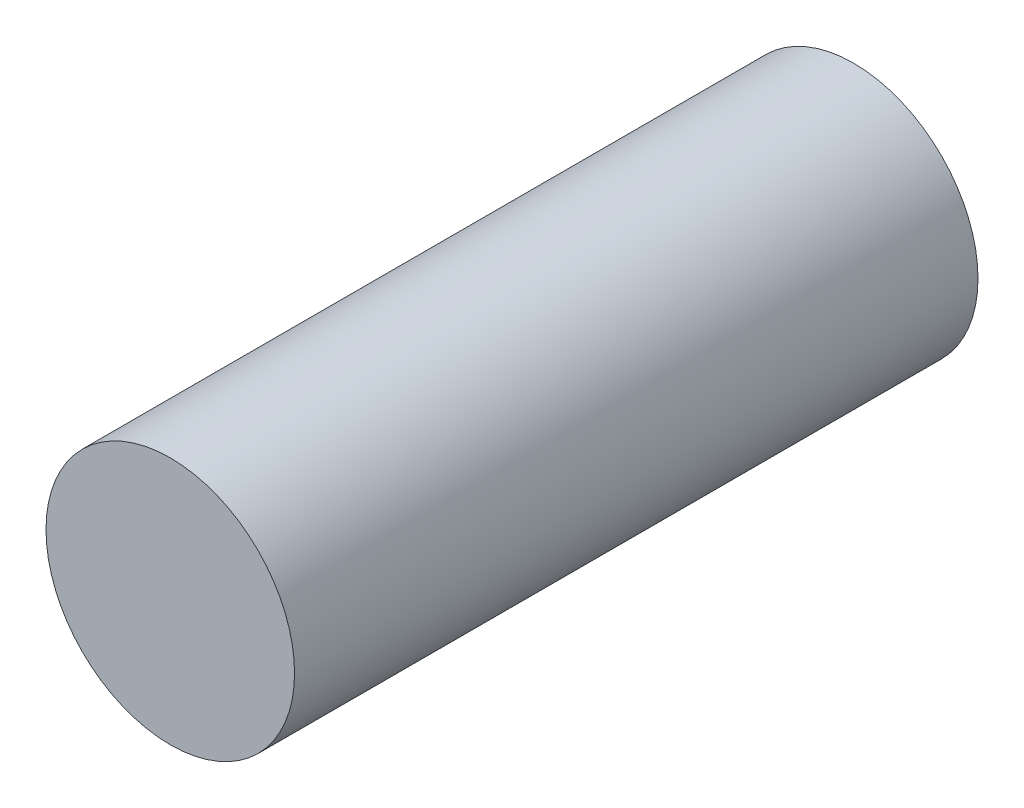
ISO-10303-21;
HEADER;
FILE_DESCRIPTION(('STEP AP214'),'2;1');
FILE_NAME('part.step','',(''),(''),'','','');
FILE_SCHEMA(('AUTOMOTIVE_DESIGN { 1 0 10303 214 1 1 1 1 }'));
ENDSEC;
DATA;
#1=APPLICATION_CONTEXT('core data for automotive mechanical design processes');
#2=APPLICATION_PROTOCOL_DEFINITION('international standard','automotive_design',2000,#1);
#3=PRODUCT_CONTEXT('',#1,'mechanical');
#4=PRODUCT('Part','Part','',(#3));
#5=PRODUCT_RELATED_PRODUCT_CATEGORY('part','',(#4));
#6=PRODUCT_DEFINITION_FORMATION('','',#4);
#7=PRODUCT_DEFINITION_CONTEXT('part definition',#1,'design');
#8=PRODUCT_DEFINITION('design','',#6,#7);
#9=PRODUCT_DEFINITION_SHAPE('','',#8);
#10=(LENGTH_UNIT() NAMED_UNIT(*) SI_UNIT(.MILLI.,.METRE.));
#11=(NAMED_UNIT(*) PLANE_ANGLE_UNIT() SI_UNIT($,.RADIAN.));
#12=(NAMED_UNIT(*) SI_UNIT($,.STERADIAN.) SOLID_ANGLE_UNIT());
#13=UNCERTAINTY_MEASURE_WITH_UNIT(LENGTH_MEASURE(1.E-05),#10,'distance_accuracy_value','');
#14=(GEOMETRIC_REPRESENTATION_CONTEXT(3) GLOBAL_UNCERTAINTY_ASSIGNED_CONTEXT((#13)) GLOBAL_UNIT_ASSIGNED_CONTEXT((#10,
#11,#12)) REPRESENTATION_CONTEXT('',''));
#15=CARTESIAN_POINT('',(0.,0.,0.));
#16=DIRECTION('',(0.,0.,1.));
#17=DIRECTION('',(1.,0.,0.));
#18=AXIS2_PLACEMENT_3D('',#15,#16,#17);
#19=CARTESIAN_POINT('',(0.,0.,55.));
#20=DIRECTION('',(0.,0.,-1.));
#21=DIRECTION('',(-1.,0.,0.));
#22=AXIS2_PLACEMENT_3D('',#19,#20,#21);
#23=CYLINDRICAL_SURFACE('',#22,10.);
#24=CARTESIAN_POINT('',(0.,0.,55.));
#25=DIRECTION('',(0.,0.,1.));
#26=DIRECTION('',(1.,0.,0.));
#27=AXIS2_PLACEMENT_3D('',#24,#25,#26);
#28=CIRCLE('',#27,10.);
#29=CARTESIAN_POINT('',(10.,0.,55.));
#30=VERTEX_POINT('',#29);
#31=EDGE_CURVE('E10',#30,#30,#28,.T.);
#32=ORIENTED_EDGE('',*,*,#31,.F.);
#33=EDGE_LOOP('',(#32));
#34=FACE_BOUND('',#33,.T.);
#35=CARTESIAN_POINT('',(0.,0.,0.));
#36=DIRECTION('',(0.,0.,1.));
#37=DIRECTION('',(1.,0.,0.));
#38=AXIS2_PLACEMENT_3D('',#35,#36,#37);
#39=CIRCLE('',#38,10.);
#40=CARTESIAN_POINT('',(10.,0.,0.));
#41=VERTEX_POINT('',#40);
#42=EDGE_CURVE('E40',#41,#41,#39,.T.);
#43=ORIENTED_EDGE('',*,*,#42,.T.);
#44=EDGE_LOOP('',(#43));
#45=FACE_BOUND('',#44,.T.);
#46=ADVANCED_FACE('F37',(#34,#45),#23,.T.);
#47=CARTESIAN_POINT('',(0.,0.,55.));
#48=DIRECTION('',(0.,0.,1.));
#49=DIRECTION('',(1.,0.,0.));
#50=AXIS2_PLACEMENT_3D('',#47,#48,#49);
#51=PLANE('',#50);
#52=ORIENTED_EDGE('',*,*,#31,.T.);
#53=EDGE_LOOP('',(#52));
#54=FACE_BOUND('',#53,.T.);
#55=ADVANCED_FACE('F54',(#54),#51,.T.);
#56=CARTESIAN_POINT('',(0.,0.,0.));
#57=DIRECTION('',(0.,0.,1.));
#58=DIRECTION('',(1.,0.,0.));
#59=AXIS2_PLACEMENT_3D('',#56,#57,#58);
#60=PLANE('',#59);
#61=ORIENTED_EDGE('',*,*,#42,.F.);
#62=EDGE_LOOP('',(#61));
#63=FACE_BOUND('',#62,.T.);
#64=ADVANCED_FACE('F52',(#63),#60,.F.);
#65=CLOSED_SHELL('',(#46,#55,#64));
#66=MANIFOLD_SOLID_BREP('B2',#65);
#67=ADVANCED_BREP_SHAPE_REPRESENTATION('',(#18,#66),#14);
#68=SHAPE_DEFINITION_REPRESENTATION(#9,#67);
ENDSEC;
END-ISO-10303-21;
